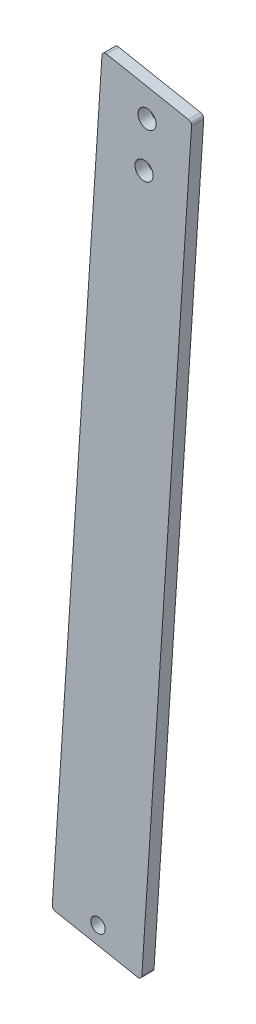
ISO-10303-21;
HEADER;
FILE_DESCRIPTION(('STEP AP214'),'2;1');
FILE_NAME('part.step','',(''),(''),'','','');
FILE_SCHEMA(('AUTOMOTIVE_DESIGN { 1 0 10303 214 1 1 1 1 }'));
ENDSEC;
DATA;
#1=APPLICATION_CONTEXT('core data for automotive mechanical design processes');
#2=APPLICATION_PROTOCOL_DEFINITION('international standard','automotive_design',2000,#1);
#3=PRODUCT_CONTEXT('',#1,'mechanical');
#4=PRODUCT('Part','Part','',(#3));
#5=PRODUCT_RELATED_PRODUCT_CATEGORY('part','',(#4));
#6=PRODUCT_DEFINITION_FORMATION('','',#4);
#7=PRODUCT_DEFINITION_CONTEXT('part definition',#1,'design');
#8=PRODUCT_DEFINITION('design','',#6,#7);
#9=PRODUCT_DEFINITION_SHAPE('','',#8);
#10=(LENGTH_UNIT() NAMED_UNIT(*) SI_UNIT(.MILLI.,.METRE.));
#11=(NAMED_UNIT(*) PLANE_ANGLE_UNIT() SI_UNIT($,.RADIAN.));
#12=(NAMED_UNIT(*) SI_UNIT($,.STERADIAN.) SOLID_ANGLE_UNIT());
#13=UNCERTAINTY_MEASURE_WITH_UNIT(LENGTH_MEASURE(1.E-05),#10,'distance_accuracy_value','');
#14=(GEOMETRIC_REPRESENTATION_CONTEXT(3) GLOBAL_UNCERTAINTY_ASSIGNED_CONTEXT((#13)) GLOBAL_UNIT_ASSIGNED_CONTEXT((#10,
#11,#12)) REPRESENTATION_CONTEXT('',''));
#15=CARTESIAN_POINT('',(0.,0.,0.));
#16=DIRECTION('',(0.,0.,1.));
#17=DIRECTION('',(1.,0.,0.));
#18=AXIS2_PLACEMENT_3D('',#15,#16,#17);
#19=CARTESIAN_POINT('',(0.,0.,1.6));
#20=DIRECTION('',(0.,0.,1.));
#21=DIRECTION('',(1.,0.,0.));
#22=AXIS2_PLACEMENT_3D('',#19,#20,#21);
#23=PLANE('',#22);
#24=CARTESIAN_POINT('',(4.84309068641644,12.756704838631,1.6));
#25=DIRECTION('',(0.,0.,1.));
#26=DIRECTION('',(1.,0.,0.));
#27=AXIS2_PLACEMENT_3D('',#24,#25,#26);
#28=CIRCLE('',#27,1.2);
#29=CARTESIAN_POINT('',(6.04309068641644,12.756704838631,1.6));
#30=VERTEX_POINT('',#29);
#31=EDGE_CURVE('E250',#30,#30,#28,.T.);
#32=ORIENTED_EDGE('',*,*,#31,.F.);
#33=EDGE_LOOP('',(#32));
#34=FACE_BOUND('',#33,.T.);
#35=DIRECTION('',(-0.982077133910275,0.188479449942372,0.));
#36=VECTOR('',#35,1.);
#37=CARTESIAN_POINT('',(4.13115995298987,-85.7741718610232,1.6));
#38=LINE('',#37,#36);
#39=CARTESIAN_POINT('',(3.5749056483292,-85.6674159843711,1.6));
#40=VERTEX_POINT('',#39);
#41=CARTESIAN_POINT('',(-7.2202968749647,-83.5956094394966,1.6));
#42=VERTEX_POINT('',#41);
#43=EDGE_CURVE('E177',#40,#42,#38,.T.);
#44=ORIENTED_EDGE('',*,*,#43,.F.);
#45=CARTESIAN_POINT('',(3.66914537330039,-85.176377417416,1.6));
#46=DIRECTION('',(0.,0.,1.));
#47=DIRECTION('',(1.,0.,0.));
#48=AXIS2_PLACEMENT_3D('',#45,#46,#47);
#49=CIRCLE('',#48,0.5);
#50=CARTESIAN_POINT('',(4.1680819251645,-85.2089706255114,1.6));
#51=VERTEX_POINT('',#50);
#52=EDGE_CURVE('E228',#40,#51,#49,.T.);
#53=ORIENTED_EDGE('',*,*,#52,.T.);
#54=DIRECTION('',(0.0651864161908729,0.99787310372822,0.));
#55=VECTOR('',#54,1.);
#56=CARTESIAN_POINT('',(4.13115995298987,-85.7741718610232,1.6));
#57=LINE('',#56,#55);
#58=CARTESIAN_POINT('',(10.7067815378023,14.8853873417081,1.6));
#59=VERTEX_POINT('',#58);
#60=EDGE_CURVE('E197',#51,#59,#57,.T.);
#61=ORIENTED_EDGE('',*,*,#60,.T.);
#62=CARTESIAN_POINT('',(10.2078449859382,14.9179805498035,1.6));
#63=DIRECTION('',(0.,0.,1.));
#64=DIRECTION('',(1.,0.,0.));
#65=AXIS2_PLACEMENT_3D('',#62,#63,#64);
#66=CIRCLE('',#65,0.5);
#67=CARTESIAN_POINT('',(10.3020847109094,15.4090191167587,1.6));
#68=VERTEX_POINT('',#67);
#69=EDGE_CURVE('E201',#59,#68,#66,.T.);
#70=ORIENTED_EDGE('',*,*,#69,.T.);
#71=DIRECTION('',(-0.982077133910275,0.188479449942372,0.));
#72=VECTOR('',#71,1.);
#73=CARTESIAN_POINT('',(10.7355534898781,15.3258281389768,1.6));
#74=LINE('',#73,#72);
#75=CARTESIAN_POINT('',(-0.493117812384545,17.4808256616332,1.6));
#76=VERTEX_POINT('',#75);
#77=EDGE_CURVE('E175',#68,#76,#74,.T.);
#78=ORIENTED_EDGE('',*,*,#77,.T.);
#79=CARTESIAN_POINT('',(-0.587357537355729,16.9897870946781,1.6));
#80=DIRECTION('',(0.,0.,1.));
#81=DIRECTION('',(1.,0.,0.));
#82=AXIS2_PLACEMENT_3D('',#79,#80,#81);
#83=CIRCLE('',#82,0.5);
#84=CARTESIAN_POINT('',(-1.08629408921984,17.0223803027735,1.6));
#85=VERTEX_POINT('',#84);
#86=EDGE_CURVE('E106',#76,#85,#83,.T.);
#87=ORIENTED_EDGE('',*,*,#86,.T.);
#88=DIRECTION('',(0.0651864161908729,0.99787310372822,0.));
#89=VECTOR('',#88,1.);
#90=CARTESIAN_POINT('',(-7.65376565393343,-83.5124184617147,1.6));
#91=LINE('',#90,#89);
#92=CARTESIAN_POINT('',(-7.62499370185763,-83.071977664446,1.6));
#93=VERTEX_POINT('',#92);
#94=EDGE_CURVE('E238',#93,#85,#91,.T.);
#95=ORIENTED_EDGE('',*,*,#94,.F.);
#96=CARTESIAN_POINT('',(-7.12605714999352,-83.1045708725415,1.6));
#97=DIRECTION('',(0.,0.,1.));
#98=DIRECTION('',(1.,0.,0.));
#99=AXIS2_PLACEMENT_3D('',#96,#97,#98);
#100=CIRCLE('',#99,0.5);
#101=EDGE_CURVE('E225',#93,#42,#100,.T.);
#102=ORIENTED_EDGE('',*,*,#101,.T.);
#103=EDGE_LOOP('',(#44,#53,#61,#70,#78,#87,#95,#102));
#104=FACE_BOUND('',#103,.T.);
#105=CARTESIAN_POINT('',(4.45062788295479,6.67757818303747,1.6));
#106=DIRECTION('',(0.,0.,1.));
#107=DIRECTION('',(1.,0.,0.));
#108=AXIS2_PLACEMENT_3D('',#105,#106,#107);
#109=CIRCLE('',#108,1.2);
#110=CARTESIAN_POINT('',(5.65062788295479,6.67757818303747,1.6));
#111=VERTEX_POINT('',#110);
#112=EDGE_CURVE('E191',#111,#111,#109,.T.);
#113=ORIENTED_EDGE('',*,*,#112,.F.);
#114=EDGE_LOOP('',(#113));
#115=FACE_BOUND('',#114,.T.);
#116=CARTESIAN_POINT('',(-1.61137409323277,-82.3481870227941,1.6));
#117=DIRECTION('',(0.,0.,1.));
#118=DIRECTION('',(1.,0.,0.));
#119=AXIS2_PLACEMENT_3D('',#116,#117,#118);
#120=CIRCLE('',#119,0.950000000000004);
#121=CARTESIAN_POINT('',(-0.66137409323277,-82.3481870227941,1.6));
#122=VERTEX_POINT('',#121);
#123=EDGE_CURVE('E258',#122,#122,#120,.T.);
#124=ORIENTED_EDGE('',*,*,#123,.F.);
#125=EDGE_LOOP('',(#124));
#126=FACE_BOUND('',#125,.T.);
#127=ADVANCED_FACE('F90',(#34,#104,#115,#126),#23,.T.);
#128=CARTESIAN_POINT('',(0.,0.,0.));
#129=DIRECTION('',(0.,0.,1.));
#130=DIRECTION('',(1.,0.,0.));
#131=AXIS2_PLACEMENT_3D('',#128,#129,#130);
#132=PLANE('',#131);
#133=DIRECTION('',(0.0651864161908729,0.99787310372822,0.));
#134=VECTOR('',#133,1.);
#135=CARTESIAN_POINT('',(4.13115995298987,-85.7741718610232,0.));
#136=LINE('',#135,#134);
#137=CARTESIAN_POINT('',(4.1680819251645,-85.2089706255114,0.));
#138=VERTEX_POINT('',#137);
#139=CARTESIAN_POINT('',(10.7067815378023,14.8853873417081,0.));
#140=VERTEX_POINT('',#139);
#141=EDGE_CURVE('E185',#138,#140,#136,.T.);
#142=ORIENTED_EDGE('',*,*,#141,.F.);
#143=CARTESIAN_POINT('',(3.66914537330039,-85.176377417416,0.));
#144=DIRECTION('',(0.,0.,1.));
#145=DIRECTION('',(1.,0.,0.));
#146=AXIS2_PLACEMENT_3D('',#143,#144,#145);
#147=CIRCLE('',#146,0.5);
#148=CARTESIAN_POINT('',(3.5749056483292,-85.6674159843711,0.));
#149=VERTEX_POINT('',#148);
#150=EDGE_CURVE('E213',#138,#149,#147,.F.);
#151=ORIENTED_EDGE('',*,*,#150,.T.);
#152=DIRECTION('',(-0.982077133910275,0.188479449942372,0.));
#153=VECTOR('',#152,1.);
#154=CARTESIAN_POINT('',(4.13115995298987,-85.7741718610232,0.));
#155=LINE('',#154,#153);
#156=CARTESIAN_POINT('',(-7.2202968749647,-83.5956094394966,0.));
#157=VERTEX_POINT('',#156);
#158=EDGE_CURVE('E189',#149,#157,#155,.T.);
#159=ORIENTED_EDGE('',*,*,#158,.T.);
#160=CARTESIAN_POINT('',(-7.12605714999352,-83.1045708725415,0.));
#161=DIRECTION('',(0.,0.,1.));
#162=DIRECTION('',(1.,0.,0.));
#163=AXIS2_PLACEMENT_3D('',#160,#161,#162);
#164=CIRCLE('',#163,0.5);
#165=CARTESIAN_POINT('',(-7.62499370185763,-83.071977664446,0.));
#166=VERTEX_POINT('',#165);
#167=EDGE_CURVE('E210',#157,#166,#164,.F.);
#168=ORIENTED_EDGE('',*,*,#167,.T.);
#169=DIRECTION('',(0.0651864161908729,0.99787310372822,0.));
#170=VECTOR('',#169,1.);
#171=CARTESIAN_POINT('',(-7.65376565393343,-83.5124184617147,0.));
#172=LINE('',#171,#170);
#173=CARTESIAN_POINT('',(-1.08629408921984,17.0223803027735,0.));
#174=VERTEX_POINT('',#173);
#175=EDGE_CURVE('E184',#166,#174,#172,.T.);
#176=ORIENTED_EDGE('',*,*,#175,.T.);
#177=CARTESIAN_POINT('',(-0.587357537355729,16.9897870946781,0.));
#178=DIRECTION('',(0.,0.,1.));
#179=DIRECTION('',(1.,0.,0.));
#180=AXIS2_PLACEMENT_3D('',#177,#178,#179);
#181=CIRCLE('',#180,0.5);
#182=CARTESIAN_POINT('',(-0.493117812384545,17.4808256616332,0.));
#183=VERTEX_POINT('',#182);
#184=EDGE_CURVE('E182',#174,#183,#181,.F.);
#185=ORIENTED_EDGE('',*,*,#184,.T.);
#186=DIRECTION('',(-0.982077133910275,0.188479449942372,0.));
#187=VECTOR('',#186,1.);
#188=CARTESIAN_POINT('',(10.7355534898781,15.3258281389768,0.));
#189=LINE('',#188,#187);
#190=CARTESIAN_POINT('',(10.3020847109094,15.4090191167587,0.));
#191=VERTEX_POINT('',#190);
#192=EDGE_CURVE('E173',#191,#183,#189,.T.);
#193=ORIENTED_EDGE('',*,*,#192,.F.);
#194=CARTESIAN_POINT('',(10.2078449859382,14.9179805498035,0.));
#195=DIRECTION('',(0.,0.,1.));
#196=DIRECTION('',(1.,0.,0.));
#197=AXIS2_PLACEMENT_3D('',#194,#195,#196);
#198=CIRCLE('',#197,0.5);
#199=EDGE_CURVE('E157',#191,#140,#198,.F.);
#200=ORIENTED_EDGE('',*,*,#199,.T.);
#201=EDGE_LOOP('',(#142,#151,#159,#168,#176,#185,#193,#200));
#202=FACE_BOUND('',#201,.T.);
#203=CARTESIAN_POINT('',(4.45062788295479,6.67757818303747,0.));
#204=DIRECTION('',(0.,0.,1.));
#205=DIRECTION('',(1.,0.,0.));
#206=AXIS2_PLACEMENT_3D('',#203,#204,#205);
#207=CIRCLE('',#206,1.2);
#208=CARTESIAN_POINT('',(5.65062788295479,6.67757818303747,0.));
#209=VERTEX_POINT('',#208);
#210=EDGE_CURVE('E246',#209,#209,#207,.T.);
#211=ORIENTED_EDGE('',*,*,#210,.T.);
#212=EDGE_LOOP('',(#211));
#213=FACE_BOUND('',#212,.T.);
#214=CARTESIAN_POINT('',(4.84309068641644,12.756704838631,0.));
#215=DIRECTION('',(0.,0.,1.));
#216=DIRECTION('',(1.,0.,0.));
#217=AXIS2_PLACEMENT_3D('',#214,#215,#216);
#218=CIRCLE('',#217,1.2);
#219=CARTESIAN_POINT('',(6.04309068641644,12.756704838631,0.));
#220=VERTEX_POINT('',#219);
#221=EDGE_CURVE('E254',#220,#220,#218,.T.);
#222=ORIENTED_EDGE('',*,*,#221,.T.);
#223=EDGE_LOOP('',(#222));
#224=FACE_BOUND('',#223,.T.);
#225=CARTESIAN_POINT('',(-1.61137409323277,-82.3481870227941,0.));
#226=DIRECTION('',(0.,0.,1.));
#227=DIRECTION('',(1.,0.,0.));
#228=AXIS2_PLACEMENT_3D('',#225,#226,#227);
#229=CIRCLE('',#228,0.950000000000004);
#230=CARTESIAN_POINT('',(-0.66137409323277,-82.3481870227941,0.));
#231=VERTEX_POINT('',#230);
#232=EDGE_CURVE('E262',#231,#231,#229,.T.);
#233=ORIENTED_EDGE('',*,*,#232,.T.);
#234=EDGE_LOOP('',(#233));
#235=FACE_BOUND('',#234,.T.);
#236=ADVANCED_FACE('F179',(#202,#213,#224,#235),#132,.F.);
#237=CARTESIAN_POINT('',(4.13115995298987,-85.7741718610232,1.6));
#238=DIRECTION('',(-0.99787310372822,0.0651864161908729,0.));
#239=DIRECTION('',(-0.0651864161908729,-0.99787310372822,0.));
#240=AXIS2_PLACEMENT_3D('',#237,#238,#239);
#241=PLANE('',#240);
#242=ORIENTED_EDGE('',*,*,#60,.F.);
#243=DIRECTION('',(0.,0.,-1.));
#244=VECTOR('',#243,1.);
#245=CARTESIAN_POINT('',(4.1680819251645,-85.2089706255114,0.));
#246=LINE('',#245,#244);
#247=EDGE_CURVE('E204',#51,#138,#246,.T.);
#248=ORIENTED_EDGE('',*,*,#247,.T.);
#249=ORIENTED_EDGE('',*,*,#141,.T.);
#250=DIRECTION('',(0.,0.,-1.));
#251=VECTOR('',#250,1.);
#252=CARTESIAN_POINT('',(10.7067815378023,14.8853873417081,1.6));
#253=LINE('',#252,#251);
#254=EDGE_CURVE('E163',#140,#59,#253,.F.);
#255=ORIENTED_EDGE('',*,*,#254,.T.);
#256=EDGE_LOOP('',(#242,#248,#249,#255));
#257=FACE_BOUND('',#256,.T.);
#258=ADVANCED_FACE('F280',(#257),#241,.F.);
#259=CARTESIAN_POINT('',(10.7355534898781,15.3258281389768,1.6));
#260=DIRECTION('',(-0.188479449942372,-0.982077133910275,0.));
#261=DIRECTION('',(0.982077133910275,-0.188479449942372,0.));
#262=AXIS2_PLACEMENT_3D('',#259,#260,#261);
#263=PLANE('',#262);
#264=ORIENTED_EDGE('',*,*,#192,.T.);
#265=DIRECTION('',(0.,0.,-1.));
#266=VECTOR('',#265,1.);
#267=CARTESIAN_POINT('',(-0.493117812384544,17.4808256616332,1.6));
#268=LINE('',#267,#266);
#269=EDGE_CURVE('E12',#183,#76,#268,.F.);
#270=ORIENTED_EDGE('',*,*,#269,.T.);
#271=ORIENTED_EDGE('',*,*,#77,.F.);
#272=DIRECTION('',(0.,0.,-1.));
#273=VECTOR('',#272,1.);
#274=CARTESIAN_POINT('',(10.3020847109094,15.4090191167587,1.6));
#275=LINE('',#274,#273);
#276=EDGE_CURVE('E161',#68,#191,#275,.T.);
#277=ORIENTED_EDGE('',*,*,#276,.T.);
#278=EDGE_LOOP('',(#264,#270,#271,#277));
#279=FACE_BOUND('',#278,.T.);
#280=ADVANCED_FACE('F172',(#279),#263,.F.);
#281=CARTESIAN_POINT('',(-7.65376565393343,-83.5124184617147,1.6));
#282=DIRECTION('',(-0.99787310372822,0.0651864161908729,0.));
#283=DIRECTION('',(-0.0651864161908729,-0.99787310372822,0.));
#284=AXIS2_PLACEMENT_3D('',#281,#282,#283);
#285=PLANE('',#284);
#286=ORIENTED_EDGE('',*,*,#175,.F.);
#287=DIRECTION('',(0.,0.,-1.));
#288=VECTOR('',#287,1.);
#289=CARTESIAN_POINT('',(-7.62499370185763,-83.071977664446,1.6));
#290=LINE('',#289,#288);
#291=EDGE_CURVE('E99',#166,#93,#290,.F.);
#292=ORIENTED_EDGE('',*,*,#291,.T.);
#293=ORIENTED_EDGE('',*,*,#94,.T.);
#294=DIRECTION('',(0.,0.,-1.));
#295=VECTOR('',#294,1.);
#296=CARTESIAN_POINT('',(-1.08629408921984,17.0223803027735,0.));
#297=LINE('',#296,#295);
#298=EDGE_CURVE('E231',#85,#174,#297,.T.);
#299=ORIENTED_EDGE('',*,*,#298,.T.);
#300=EDGE_LOOP('',(#286,#292,#293,#299));
#301=FACE_BOUND('',#300,.T.);
#302=ADVANCED_FACE('F290',(#301),#285,.T.);
#303=CARTESIAN_POINT('',(4.13115995298987,-85.7741718610232,1.6));
#304=DIRECTION('',(-0.188479449942372,-0.982077133910275,0.));
#305=DIRECTION('',(0.982077133910275,-0.188479449942372,0.));
#306=AXIS2_PLACEMENT_3D('',#303,#304,#305);
#307=PLANE('',#306);
#308=ORIENTED_EDGE('',*,*,#158,.F.);
#309=DIRECTION('',(0.,0.,-1.));
#310=VECTOR('',#309,1.);
#311=CARTESIAN_POINT('',(3.5749056483292,-85.6674159843711,1.6));
#312=LINE('',#311,#310);
#313=EDGE_CURVE('E220',#149,#40,#312,.F.);
#314=ORIENTED_EDGE('',*,*,#313,.T.);
#315=ORIENTED_EDGE('',*,*,#43,.T.);
#316=DIRECTION('',(0.,0.,-1.));
#317=VECTOR('',#316,1.);
#318=CARTESIAN_POINT('',(-7.22029687496471,-83.5956094394966,1.6));
#319=LINE('',#318,#317);
#320=EDGE_CURVE('E216',#42,#157,#319,.T.);
#321=ORIENTED_EDGE('',*,*,#320,.T.);
#322=EDGE_LOOP('',(#308,#314,#315,#321));
#323=FACE_BOUND('',#322,.T.);
#324=ADVANCED_FACE('F287',(#323),#307,.T.);
#325=CARTESIAN_POINT('',(4.45062788295479,6.67757818303747,1.6));
#326=DIRECTION('',(0.,0.,-1.));
#327=DIRECTION('',(-1.,0.,0.));
#328=AXIS2_PLACEMENT_3D('',#325,#326,#327);
#329=CYLINDRICAL_SURFACE('',#328,1.2);
#330=ORIENTED_EDGE('',*,*,#112,.T.);
#331=EDGE_LOOP('',(#330));
#332=FACE_BOUND('',#331,.T.);
#333=ORIENTED_EDGE('',*,*,#210,.F.);
#334=EDGE_LOOP('',(#333));
#335=FACE_BOUND('',#334,.T.);
#336=ADVANCED_FACE('F284',(#332,#335),#329,.F.);
#337=CARTESIAN_POINT('',(4.84309068641644,12.756704838631,1.6));
#338=DIRECTION('',(0.,0.,-1.));
#339=DIRECTION('',(-1.,0.,0.));
#340=AXIS2_PLACEMENT_3D('',#337,#338,#339);
#341=CYLINDRICAL_SURFACE('',#340,1.2);
#342=ORIENTED_EDGE('',*,*,#31,.T.);
#343=EDGE_LOOP('',(#342));
#344=FACE_BOUND('',#343,.T.);
#345=ORIENTED_EDGE('',*,*,#221,.F.);
#346=EDGE_LOOP('',(#345));
#347=FACE_BOUND('',#346,.T.);
#348=ADVANCED_FACE('F323',(#344,#347),#341,.F.);
#349=CARTESIAN_POINT('',(-1.61137409323277,-82.3481870227941,1.6));
#350=DIRECTION('',(0.,0.,-1.));
#351=DIRECTION('',(-1.,0.,0.));
#352=AXIS2_PLACEMENT_3D('',#349,#350,#351);
#353=CYLINDRICAL_SURFACE('',#352,0.950000000000004);
#354=ORIENTED_EDGE('',*,*,#123,.T.);
#355=EDGE_LOOP('',(#354));
#356=FACE_BOUND('',#355,.T.);
#357=ORIENTED_EDGE('',*,*,#232,.F.);
#358=EDGE_LOOP('',(#357));
#359=FACE_BOUND('',#358,.T.);
#360=ADVANCED_FACE('F270',(#356,#359),#353,.F.);
#361=CARTESIAN_POINT('',(10.2078449859382,14.9179805498035,1.6));
#362=DIRECTION('',(0.,0.,-1.));
#363=DIRECTION('',(-1.,0.,0.));
#364=AXIS2_PLACEMENT_3D('',#361,#362,#363);
#365=CYLINDRICAL_SURFACE('',#364,0.5);
#366=ORIENTED_EDGE('',*,*,#69,.F.);
#367=ORIENTED_EDGE('',*,*,#254,.F.);
#368=ORIENTED_EDGE('',*,*,#199,.F.);
#369=ORIENTED_EDGE('',*,*,#276,.F.);
#370=EDGE_LOOP('',(#366,#367,#368,#369));
#371=FACE_BOUND('',#370,.T.);
#372=ADVANCED_FACE('F160',(#371),#365,.T.);
#373=CARTESIAN_POINT('',(3.66914537330039,-85.176377417416,1.6));
#374=DIRECTION('',(0.,0.,1.));
#375=DIRECTION('',(1.,0.,0.));
#376=AXIS2_PLACEMENT_3D('',#373,#374,#375);
#377=CYLINDRICAL_SURFACE('',#376,0.5);
#378=ORIENTED_EDGE('',*,*,#52,.F.);
#379=ORIENTED_EDGE('',*,*,#313,.F.);
#380=ORIENTED_EDGE('',*,*,#150,.F.);
#381=ORIENTED_EDGE('',*,*,#247,.F.);
#382=EDGE_LOOP('',(#378,#379,#380,#381));
#383=FACE_BOUND('',#382,.T.);
#384=ADVANCED_FACE('F300',(#383),#377,.T.);
#385=CARTESIAN_POINT('',(-7.12605714999352,-83.1045708725415,1.6));
#386=DIRECTION('',(0.,0.,-1.));
#387=DIRECTION('',(-1.,0.,0.));
#388=AXIS2_PLACEMENT_3D('',#385,#386,#387);
#389=CYLINDRICAL_SURFACE('',#388,0.5);
#390=ORIENTED_EDGE('',*,*,#101,.F.);
#391=ORIENTED_EDGE('',*,*,#291,.F.);
#392=ORIENTED_EDGE('',*,*,#167,.F.);
#393=ORIENTED_EDGE('',*,*,#320,.F.);
#394=EDGE_LOOP('',(#390,#391,#392,#393));
#395=FACE_BOUND('',#394,.T.);
#396=ADVANCED_FACE('F302',(#395),#389,.T.);
#397=CARTESIAN_POINT('',(-0.587357537355729,16.9897870946781,1.6));
#398=DIRECTION('',(0.,0.,1.));
#399=DIRECTION('',(1.,0.,0.));
#400=AXIS2_PLACEMENT_3D('',#397,#398,#399);
#401=CYLINDRICAL_SURFACE('',#400,0.5);
#402=ORIENTED_EDGE('',*,*,#86,.F.);
#403=ORIENTED_EDGE('',*,*,#269,.F.);
#404=ORIENTED_EDGE('',*,*,#184,.F.);
#405=ORIENTED_EDGE('',*,*,#298,.F.);
#406=EDGE_LOOP('',(#402,#403,#404,#405));
#407=FACE_BOUND('',#406,.T.);
#408=ADVANCED_FACE('F92',(#407),#401,.T.);
#409=CLOSED_SHELL('',(#127,#236,#258,#280,#302,#324,#336,#348,#360,#372,#384,#396,#408));
#410=MANIFOLD_SOLID_BREP('B2',#409);
#411=ADVANCED_BREP_SHAPE_REPRESENTATION('',(#18,#410),#14);
#412=SHAPE_DEFINITION_REPRESENTATION(#9,#411);
ENDSEC;
END-ISO-10303-21;
